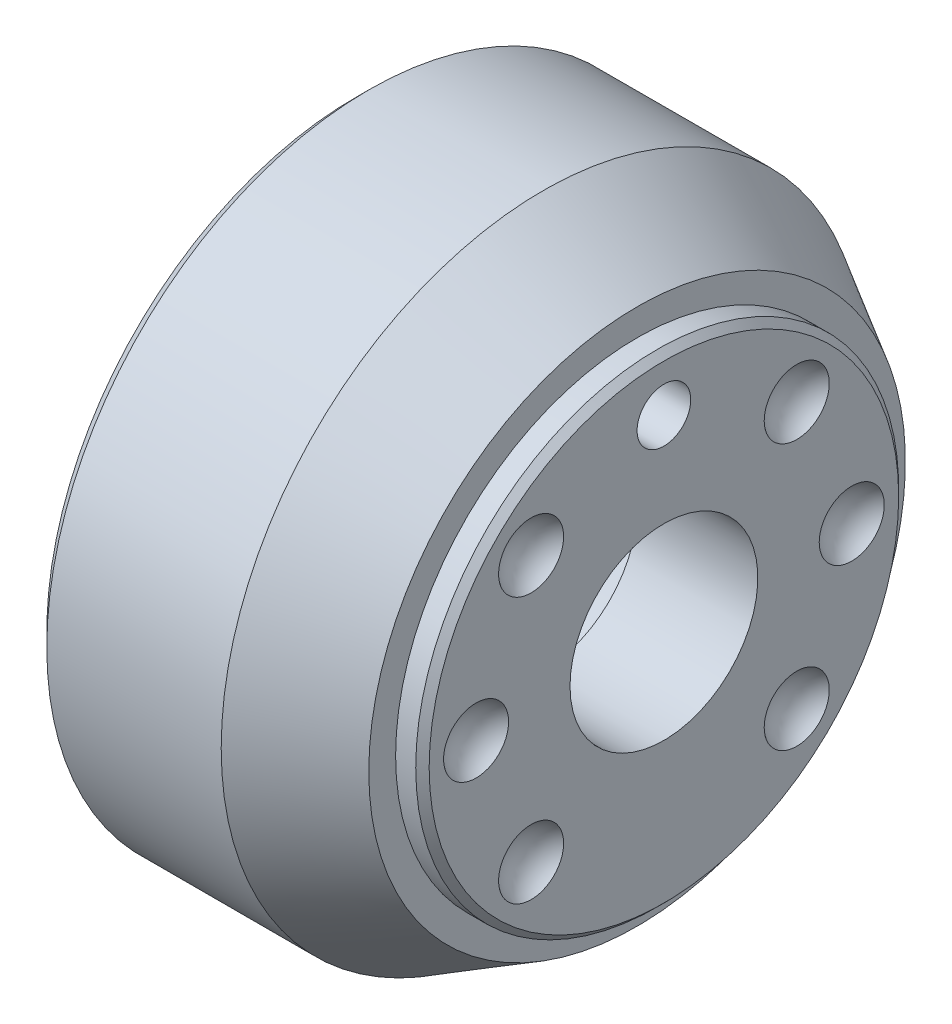
ISO-10303-21;
HEADER;
FILE_DESCRIPTION(('STEP AP214'),'2;1');
FILE_NAME('part.step','',(''),(''),'','','');
FILE_SCHEMA(('AUTOMOTIVE_DESIGN { 1 0 10303 214 1 1 1 1 }'));
ENDSEC;
DATA;
#1=APPLICATION_CONTEXT('core data for automotive mechanical design processes');
#2=APPLICATION_PROTOCOL_DEFINITION('international standard','automotive_design',2000,#1);
#3=PRODUCT_CONTEXT('',#1,'mechanical');
#4=PRODUCT('Part','Part','',(#3));
#5=PRODUCT_RELATED_PRODUCT_CATEGORY('part','',(#4));
#6=PRODUCT_DEFINITION_FORMATION('','',#4);
#7=PRODUCT_DEFINITION_CONTEXT('part definition',#1,'design');
#8=PRODUCT_DEFINITION('design','',#6,#7);
#9=PRODUCT_DEFINITION_SHAPE('','',#8);
#10=(LENGTH_UNIT() NAMED_UNIT(*) SI_UNIT(.MILLI.,.METRE.));
#11=(NAMED_UNIT(*) PLANE_ANGLE_UNIT() SI_UNIT($,.RADIAN.));
#12=(NAMED_UNIT(*) SI_UNIT($,.STERADIAN.) SOLID_ANGLE_UNIT());
#13=UNCERTAINTY_MEASURE_WITH_UNIT(LENGTH_MEASURE(1.E-05),#10,'distance_accuracy_value','');
#14=(GEOMETRIC_REPRESENTATION_CONTEXT(3) GLOBAL_UNCERTAINTY_ASSIGNED_CONTEXT((#13)) GLOBAL_UNIT_ASSIGNED_CONTEXT((#10,
#11,#12)) REPRESENTATION_CONTEXT('',''));
#15=CARTESIAN_POINT('',(0.,0.,0.));
#16=DIRECTION('',(0.,0.,1.));
#17=DIRECTION('',(1.,0.,0.));
#18=AXIS2_PLACEMENT_3D('',#15,#16,#17);
#19=CARTESIAN_POINT('',(-9.,7.,0.));
#20=DIRECTION('',(1.,0.,0.));
#21=DIRECTION('',(0.,0.,-1.));
#22=AXIS2_PLACEMENT_3D('',#19,#20,#21);
#23=PLANE('',#22);
#24=CARTESIAN_POINT('',(-9.,0.,0.));
#25=DIRECTION('',(-1.,0.,0.));
#26=DIRECTION('',(0.,0.,1.));
#27=AXIS2_PLACEMENT_3D('',#24,#25,#26);
#28=CIRCLE('',#27,7.);
#29=CARTESIAN_POINT('',(-9.,0.,7.));
#30=VERTEX_POINT('',#29);
#31=EDGE_CURVE('E111',#30,#30,#28,.T.);
#32=ORIENTED_EDGE('',*,*,#31,.F.);
#33=EDGE_LOOP('',(#32));
#34=FACE_BOUND('',#33,.T.);
#35=CARTESIAN_POINT('',(-9.,0.,0.));
#36=DIRECTION('',(-1.,0.,0.));
#37=DIRECTION('',(0.,0.,1.));
#38=AXIS2_PLACEMENT_3D('',#35,#36,#37);
#39=CIRCLE('',#38,9.);
#40=CARTESIAN_POINT('',(-9.,0.,9.));
#41=VERTEX_POINT('',#40);
#42=EDGE_CURVE('E139',#41,#41,#39,.T.);
#43=ORIENTED_EDGE('',*,*,#42,.T.);
#44=EDGE_LOOP('',(#43));
#45=FACE_BOUND('',#44,.T.);
#46=ADVANCED_FACE('F41',(#34,#45),#23,.F.);
#47=CARTESIAN_POINT('',(-36.9218818886025,0.,0.));
#48=DIRECTION('',(-1.,0.,0.));
#49=DIRECTION('',(0.,0.,1.));
#50=AXIS2_PLACEMENT_3D('',#47,#48,#49);
#51=CYLINDRICAL_SURFACE('',#50,9.);
#52=ORIENTED_EDGE('',*,*,#42,.F.);
#53=EDGE_LOOP('',(#52));
#54=FACE_BOUND('',#53,.T.);
#55=CARTESIAN_POINT('',(-8.,0.,0.));
#56=DIRECTION('',(-1.,0.,0.));
#57=DIRECTION('',(0.,0.,1.));
#58=AXIS2_PLACEMENT_3D('',#55,#56,#57);
#59=CIRCLE('',#58,9.);
#60=CARTESIAN_POINT('',(-8.,0.,9.));
#61=VERTEX_POINT('',#60);
#62=EDGE_CURVE('E136',#61,#61,#59,.T.);
#63=ORIENTED_EDGE('',*,*,#62,.T.);
#64=EDGE_LOOP('',(#63));
#65=FACE_BOUND('',#64,.T.);
#66=ADVANCED_FACE('F179',(#54,#65),#51,.T.);
#67=CARTESIAN_POINT('',(-8.,9.,0.));
#68=DIRECTION('',(1.,0.,0.));
#69=DIRECTION('',(0.,0.,-1.));
#70=AXIS2_PLACEMENT_3D('',#67,#68,#69);
#71=PLANE('',#70);
#72=ORIENTED_EDGE('',*,*,#62,.F.);
#73=EDGE_LOOP('',(#72));
#74=FACE_BOUND('',#73,.T.);
#75=CARTESIAN_POINT('',(-8.,0.,0.));
#76=DIRECTION('',(-1.,0.,0.));
#77=DIRECTION('',(0.,0.,1.));
#78=AXIS2_PLACEMENT_3D('',#75,#76,#77);
#79=CIRCLE('',#78,18.);
#80=CARTESIAN_POINT('',(-8.,0.,18.));
#81=VERTEX_POINT('',#80);
#82=EDGE_CURVE('E133',#81,#81,#79,.T.);
#83=ORIENTED_EDGE('',*,*,#82,.T.);
#84=EDGE_LOOP('',(#83));
#85=FACE_BOUND('',#84,.T.);
#86=ADVANCED_FACE('F185',(#74,#85),#71,.F.);
#87=CARTESIAN_POINT('',(-36.9218818886025,0.,0.));
#88=DIRECTION('',(-1.,0.,0.));
#89=DIRECTION('',(0.,0.,1.));
#90=AXIS2_PLACEMENT_3D('',#87,#88,#89);
#91=CYLINDRICAL_SURFACE('',#90,18.);
#92=ORIENTED_EDGE('',*,*,#82,.F.);
#93=EDGE_LOOP('',(#92));
#94=FACE_BOUND('',#93,.T.);
#95=CARTESIAN_POINT('',(-23.,0.,0.));
#96=DIRECTION('',(-1.,0.,0.));
#97=DIRECTION('',(0.,0.,1.));
#98=AXIS2_PLACEMENT_3D('',#95,#96,#97);
#99=CIRCLE('',#98,18.);
#100=CARTESIAN_POINT('',(-23.,0.,18.));
#101=VERTEX_POINT('',#100);
#102=EDGE_CURVE('E130',#101,#101,#99,.T.);
#103=ORIENTED_EDGE('',*,*,#102,.T.);
#104=EDGE_LOOP('',(#103));
#105=FACE_BOUND('',#104,.T.);
#106=ADVANCED_FACE('F198',(#94,#105),#91,.F.);
#107=CARTESIAN_POINT('',(-23.,18.,0.));
#108=DIRECTION('',(1.,0.,0.));
#109=DIRECTION('',(0.,0.,-1.));
#110=AXIS2_PLACEMENT_3D('',#107,#108,#109);
#111=PLANE('',#110);
#112=CARTESIAN_POINT('',(-23.,0.,0.));
#113=DIRECTION('',(1.,0.,0.));
#114=DIRECTION('',(0.,0.,-1.));
#115=AXIS2_PLACEMENT_3D('',#112,#113,#114);
#116=CIRCLE('',#115,23.);
#117=CARTESIAN_POINT('',(-23.,0.,-23.));
#118=VERTEX_POINT('',#117);
#119=EDGE_CURVE('E142',#118,#118,#116,.F.);
#120=ORIENTED_EDGE('',*,*,#119,.T.);
#121=EDGE_LOOP('',(#120));
#122=FACE_BOUND('',#121,.T.);
#123=CARTESIAN_POINT('',(-23.,20.75,0.));
#124=DIRECTION('',(-1.,0.,0.));
#125=DIRECTION('',(0.,0.,1.));
#126=AXIS2_PLACEMENT_3D('',#123,#124,#125);
#127=CIRCLE('',#126,2.025);
#128=CARTESIAN_POINT('',(-23.,20.75,2.025));
#129=VERTEX_POINT('',#128);
#130=EDGE_CURVE('E80',#129,#129,#127,.T.);
#131=ORIENTED_EDGE('',*,*,#130,.F.);
#132=EDGE_LOOP('',(#131));
#133=FACE_BOUND('',#132,.T.);
#134=CARTESIAN_POINT('',(-23.,0.,20.75));
#135=DIRECTION('',(-1.,0.,0.));
#136=DIRECTION('',(0.,0.,1.));
#137=AXIS2_PLACEMENT_3D('',#134,#135,#136);
#138=CIRCLE('',#137,2.025);
#139=CARTESIAN_POINT('',(-23.,0.,22.775));
#140=VERTEX_POINT('',#139);
#141=EDGE_CURVE('E73',#140,#140,#138,.T.);
#142=ORIENTED_EDGE('',*,*,#141,.F.);
#143=EDGE_LOOP('',(#142));
#144=FACE_BOUND('',#143,.T.);
#145=CARTESIAN_POINT('',(-23.,0.,-20.75));
#146=DIRECTION('',(-1.,0.,0.));
#147=DIRECTION('',(0.,0.,1.));
#148=AXIS2_PLACEMENT_3D('',#145,#146,#147);
#149=CIRCLE('',#148,2.025);
#150=CARTESIAN_POINT('',(-23.,0.,-18.725));
#151=VERTEX_POINT('',#150);
#152=EDGE_CURVE('E89',#151,#151,#149,.T.);
#153=ORIENTED_EDGE('',*,*,#152,.F.);
#154=EDGE_LOOP('',(#153));
#155=FACE_BOUND('',#154,.T.);
#156=CARTESIAN_POINT('',(-23.,-20.75,0.));
#157=DIRECTION('',(-1.,0.,0.));
#158=DIRECTION('',(0.,0.,1.));
#159=AXIS2_PLACEMENT_3D('',#156,#157,#158);
#160=CIRCLE('',#159,2.025);
#161=CARTESIAN_POINT('',(-23.,-20.75,2.025));
#162=VERTEX_POINT('',#161);
#163=EDGE_CURVE('E98',#162,#162,#160,.T.);
#164=ORIENTED_EDGE('',*,*,#163,.F.);
#165=EDGE_LOOP('',(#164));
#166=FACE_BOUND('',#165,.T.);
#167=ORIENTED_EDGE('',*,*,#102,.F.);
#168=EDGE_LOOP('',(#167));
#169=FACE_BOUND('',#168,.T.);
#170=ADVANCED_FACE('F202',(#122,#133,#144,#155,#166,#169),#111,.F.);
#171=CARTESIAN_POINT('',(-36.9218818886025,0.,0.));
#172=DIRECTION('',(-1.,0.,0.));
#173=DIRECTION('',(0.,0.,1.));
#174=AXIS2_PLACEMENT_3D('',#171,#172,#173);
#175=CYLINDRICAL_SURFACE('',#174,24.);
#176=CARTESIAN_POINT('',(-22.,0.,0.));
#177=DIRECTION('',(1.,0.,0.));
#178=DIRECTION('',(0.,0.,-1.));
#179=AXIS2_PLACEMENT_3D('',#176,#177,#178);
#180=CIRCLE('',#179,24.);
#181=CARTESIAN_POINT('',(-22.,0.,-24.));
#182=VERTEX_POINT('',#181);
#183=EDGE_CURVE('E161',#182,#182,#180,.T.);
#184=ORIENTED_EDGE('',*,*,#183,.T.);
#185=EDGE_LOOP('',(#184));
#186=FACE_BOUND('',#185,.T.);
#187=CARTESIAN_POINT('',(-9.,0.,0.));
#188=DIRECTION('',(-1.,0.,0.));
#189=DIRECTION('',(0.,0.,1.));
#190=AXIS2_PLACEMENT_3D('',#187,#188,#189);
#191=CIRCLE('',#190,24.);
#192=CARTESIAN_POINT('',(-9.,0.,24.));
#193=VERTEX_POINT('',#192);
#194=EDGE_CURVE('E127',#193,#193,#191,.T.);
#195=ORIENTED_EDGE('',*,*,#194,.T.);
#196=EDGE_LOOP('',(#195));
#197=FACE_BOUND('',#196,.T.);
#198=ADVANCED_FACE('F206',(#186,#197),#175,.T.);
#199=CARTESIAN_POINT('',(-2.,0.,0.));
#200=DIRECTION('',(-1.,0.,0.));
#201=DIRECTION('',(0.,0.,1.));
#202=AXIS2_PLACEMENT_3D('',#199,#200,#201);
#203=CONICAL_SURFACE('',#202,20.,0.519146114246523);
#204=ORIENTED_EDGE('',*,*,#194,.F.);
#205=EDGE_LOOP('',(#204));
#206=FACE_BOUND('',#205,.T.);
#207=CARTESIAN_POINT('',(-2.,0.,0.));
#208=DIRECTION('',(-1.,0.,0.));
#209=DIRECTION('',(0.,0.,1.));
#210=AXIS2_PLACEMENT_3D('',#207,#208,#209);
#211=CIRCLE('',#210,20.);
#212=CARTESIAN_POINT('',(-2.,0.,20.));
#213=VERTEX_POINT('',#212);
#214=EDGE_CURVE('E124',#213,#213,#211,.T.);
#215=ORIENTED_EDGE('',*,*,#214,.T.);
#216=EDGE_LOOP('',(#215));
#217=FACE_BOUND('',#216,.T.);
#218=ADVANCED_FACE('F210',(#206,#217),#203,.T.);
#219=CARTESIAN_POINT('',(-2.,20.,0.));
#220=DIRECTION('',(-1.,0.,0.));
#221=DIRECTION('',(0.,0.,1.));
#222=AXIS2_PLACEMENT_3D('',#219,#220,#221);
#223=PLANE('',#222);
#224=ORIENTED_EDGE('',*,*,#214,.F.);
#225=EDGE_LOOP('',(#224));
#226=FACE_BOUND('',#225,.T.);
#227=CARTESIAN_POINT('',(-2.,0.,0.));
#228=DIRECTION('',(-1.,0.,0.));
#229=DIRECTION('',(0.,0.,1.));
#230=AXIS2_PLACEMENT_3D('',#227,#228,#229);
#231=CIRCLE('',#230,18.);
#232=CARTESIAN_POINT('',(-2.,0.,18.));
#233=VERTEX_POINT('',#232);
#234=EDGE_CURVE('E121',#233,#233,#231,.T.);
#235=ORIENTED_EDGE('',*,*,#234,.T.);
#236=EDGE_LOOP('',(#235));
#237=FACE_BOUND('',#236,.T.);
#238=ADVANCED_FACE('F214',(#226,#237),#223,.F.);
#239=CARTESIAN_POINT('',(-36.9218818886025,0.,0.));
#240=DIRECTION('',(-1.,0.,0.));
#241=DIRECTION('',(0.,0.,1.));
#242=AXIS2_PLACEMENT_3D('',#239,#240,#241);
#243=CYLINDRICAL_SURFACE('',#242,18.);
#244=CARTESIAN_POINT('',(-0.499999999999994,0.,0.));
#245=DIRECTION('',(-1.,0.,0.));
#246=DIRECTION('',(0.,0.,1.));
#247=AXIS2_PLACEMENT_3D('',#244,#245,#246);
#248=CIRCLE('',#247,18.);
#249=CARTESIAN_POINT('',(-0.499999999999994,0.,18.));
#250=VERTEX_POINT('',#249);
#251=EDGE_CURVE('E50',#250,#250,#248,.T.);
#252=ORIENTED_EDGE('',*,*,#251,.T.);
#253=EDGE_LOOP('',(#252));
#254=FACE_BOUND('',#253,.T.);
#255=ORIENTED_EDGE('',*,*,#234,.F.);
#256=EDGE_LOOP('',(#255));
#257=FACE_BOUND('',#256,.T.);
#258=ADVANCED_FACE('F166',(#254,#257),#243,.T.);
#259=CARTESIAN_POINT('',(0.,18.,0.));
#260=DIRECTION('',(-1.,0.,0.));
#261=DIRECTION('',(0.,0.,1.));
#262=AXIS2_PLACEMENT_3D('',#259,#260,#261);
#263=PLANE('',#262);
#264=CARTESIAN_POINT('',(0.,0.,0.));
#265=DIRECTION('',(-1.,0.,0.));
#266=DIRECTION('',(0.,0.,1.));
#267=AXIS2_PLACEMENT_3D('',#264,#265,#266);
#268=CIRCLE('',#267,17.5);
#269=CARTESIAN_POINT('',(0.,0.,17.5));
#270=VERTEX_POINT('',#269);
#271=EDGE_CURVE('E11',#270,#270,#268,.F.);
#272=ORIENTED_EDGE('',*,*,#271,.T.);
#273=EDGE_LOOP('',(#272));
#274=FACE_BOUND('',#273,.T.);
#275=CARTESIAN_POINT('',(0.,9.89949493661154,-9.89949493661179));
#276=DIRECTION('',(-1.,0.,0.));
#277=DIRECTION('',(0.,0.,1.));
#278=AXIS2_PLACEMENT_3D('',#275,#276,#277);
#279=CIRCLE('',#278,2.42487113059643);
#280=CARTESIAN_POINT('',(0.,9.89949493661154,-7.47462380601536));
#281=VERTEX_POINT('',#280);
#282=EDGE_CURVE('E107',#281,#281,#279,.T.);
#283=ORIENTED_EDGE('',*,*,#282,.T.);
#284=EDGE_LOOP('',(#283));
#285=FACE_BOUND('',#284,.T.);
#286=CARTESIAN_POINT('',(0.,9.89949493661175,9.89949493661158));
#287=DIRECTION('',(-1.,0.,0.));
#288=DIRECTION('',(0.,0.,1.));
#289=AXIS2_PLACEMENT_3D('',#286,#287,#288);
#290=CIRCLE('',#289,2.42487113059643);
#291=CARTESIAN_POINT('',(0.,9.89949493661175,12.324366067208));
#292=VERTEX_POINT('',#291);
#293=EDGE_CURVE('E154',#292,#292,#290,.T.);
#294=ORIENTED_EDGE('',*,*,#293,.T.);
#295=EDGE_LOOP('',(#294));
#296=FACE_BOUND('',#295,.T.);
#297=CARTESIAN_POINT('',(0.,0.,14.));
#298=DIRECTION('',(-1.,0.,0.));
#299=DIRECTION('',(0.,0.,1.));
#300=AXIS2_PLACEMENT_3D('',#297,#298,#299);
#301=CIRCLE('',#300,2.42487113059643);
#302=CARTESIAN_POINT('',(0.,0.,16.4248711305964));
#303=VERTEX_POINT('',#302);
#304=EDGE_CURVE('E151',#303,#303,#301,.T.);
#305=ORIENTED_EDGE('',*,*,#304,.T.);
#306=EDGE_LOOP('',(#305));
#307=FACE_BOUND('',#306,.T.);
#308=CARTESIAN_POINT('',(0.,-9.89949493661161,9.89949493661172));
#309=DIRECTION('',(-1.,0.,0.));
#310=DIRECTION('',(0.,0.,1.));
#311=AXIS2_PLACEMENT_3D('',#308,#309,#310);
#312=CIRCLE('',#311,2.42487113059643);
#313=CARTESIAN_POINT('',(0.,-9.89949493661161,12.3243660672081));
#314=VERTEX_POINT('',#313);
#315=EDGE_CURVE('E148',#314,#314,#312,.T.);
#316=ORIENTED_EDGE('',*,*,#315,.T.);
#317=EDGE_LOOP('',(#316));
#318=FACE_BOUND('',#317,.T.);
#319=CARTESIAN_POINT('',(0.,-9.89949493661168,-9.89949493661165));
#320=DIRECTION('',(-1.,0.,0.));
#321=DIRECTION('',(0.,0.,1.));
#322=AXIS2_PLACEMENT_3D('',#319,#320,#321);
#323=CIRCLE('',#322,2.42487113059643);
#324=CARTESIAN_POINT('',(0.,-9.89949493661168,-7.47462380601522));
#325=VERTEX_POINT('',#324);
#326=EDGE_CURVE('E145',#325,#325,#323,.T.);
#327=ORIENTED_EDGE('',*,*,#326,.T.);
#328=EDGE_LOOP('',(#327));
#329=FACE_BOUND('',#328,.T.);
#330=CARTESIAN_POINT('',(0.,0.,-14.));
#331=DIRECTION('',(-1.,0.,0.));
#332=DIRECTION('',(0.,0.,1.));
#333=AXIS2_PLACEMENT_3D('',#330,#331,#332);
#334=CIRCLE('',#333,2.42487113059643);
#335=CARTESIAN_POINT('',(0.,0.,-11.5751288694036));
#336=VERTEX_POINT('',#335);
#337=EDGE_CURVE('E115',#336,#336,#334,.T.);
#338=ORIENTED_EDGE('',*,*,#337,.T.);
#339=EDGE_LOOP('',(#338));
#340=FACE_BOUND('',#339,.T.);
#341=CARTESIAN_POINT('',(0.,14.,0.));
#342=DIRECTION('',(1.,0.,0.));
#343=DIRECTION('',(0.,0.,-1.));
#344=AXIS2_PLACEMENT_3D('',#341,#342,#343);
#345=CIRCLE('',#344,2.);
#346=CARTESIAN_POINT('',(0.,14.,-2.));
#347=VERTEX_POINT('',#346);
#348=EDGE_CURVE('E112',#347,#347,#345,.T.);
#349=ORIENTED_EDGE('',*,*,#348,.F.);
#350=EDGE_LOOP('',(#349));
#351=FACE_BOUND('',#350,.T.);
#352=CARTESIAN_POINT('',(0.,0.,0.));
#353=DIRECTION('',(-1.,0.,0.));
#354=DIRECTION('',(0.,0.,1.));
#355=AXIS2_PLACEMENT_3D('',#352,#353,#354);
#356=CIRCLE('',#355,7.);
#357=CARTESIAN_POINT('',(0.,0.,7.));
#358=VERTEX_POINT('',#357);
#359=EDGE_CURVE('E118',#358,#358,#356,.T.);
#360=ORIENTED_EDGE('',*,*,#359,.T.);
#361=EDGE_LOOP('',(#360));
#362=FACE_BOUND('',#361,.T.);
#363=ADVANCED_FACE('F221',(#274,#285,#296,#307,#318,#329,#340,#351,#362),#263,.F.);
#364=CARTESIAN_POINT('',(-36.9218818886025,0.,0.));
#365=DIRECTION('',(-1.,0.,0.));
#366=DIRECTION('',(0.,0.,1.));
#367=AXIS2_PLACEMENT_3D('',#364,#365,#366);
#368=CYLINDRICAL_SURFACE('',#367,7.);
#369=ORIENTED_EDGE('',*,*,#359,.F.);
#370=EDGE_LOOP('',(#369));
#371=FACE_BOUND('',#370,.T.);
#372=ORIENTED_EDGE('',*,*,#31,.T.);
#373=EDGE_LOOP('',(#372));
#374=FACE_BOUND('',#373,.T.);
#375=ADVANCED_FACE('F224',(#371,#374),#368,.F.);
#376=CARTESIAN_POINT('',(-4.,14.,0.));
#377=DIRECTION('',(1.,0.,0.));
#378=DIRECTION('',(0.,0.,-1.));
#379=AXIS2_PLACEMENT_3D('',#376,#377,#378);
#380=CYLINDRICAL_SURFACE('',#379,2.);
#381=CARTESIAN_POINT('',(-4.,14.,0.));
#382=DIRECTION('',(1.,0.,0.));
#383=DIRECTION('',(0.,0.,-1.));
#384=AXIS2_PLACEMENT_3D('',#381,#382,#383);
#385=CIRCLE('',#384,2.);
#386=CARTESIAN_POINT('',(-4.,14.,-2.));
#387=VERTEX_POINT('',#386);
#388=EDGE_CURVE('E108',#387,#387,#385,.T.);
#389=ORIENTED_EDGE('',*,*,#388,.F.);
#390=EDGE_LOOP('',(#389));
#391=FACE_BOUND('',#390,.T.);
#392=ORIENTED_EDGE('',*,*,#348,.T.);
#393=EDGE_LOOP('',(#392));
#394=FACE_BOUND('',#393,.T.);
#395=ADVANCED_FACE('F228',(#391,#394),#380,.F.);
#396=CARTESIAN_POINT('',(-4.,14.,0.));
#397=DIRECTION('',(1.,0.,0.));
#398=DIRECTION('',(0.,0.,-1.));
#399=AXIS2_PLACEMENT_3D('',#396,#397,#398);
#400=PLANE('',#399);
#401=ORIENTED_EDGE('',*,*,#388,.T.);
#402=EDGE_LOOP('',(#401));
#403=FACE_BOUND('',#402,.T.);
#404=ADVANCED_FACE('F232',(#403),#400,.T.);
#405=CARTESIAN_POINT('',(1.4,0.,-14.));
#406=DIRECTION('',(0.,0.,-1.));
#407=DIRECTION('',(1.,0.,0.));
#408=AXIS2_PLACEMENT_3D('',#405,#406,#407);
#409=SPHERICAL_SURFACE('',#408,2.8);
#410=CARTESIAN_POINT('',(1.4,0.,-14.));
#411=DIRECTION('',(-1.,0.,0.));
#412=DIRECTION('',(0.,0.,1.));
#413=AXIS2_PLACEMENT_3D('',#410,#411,#412);
#414=SPHERICAL_SURFACE('',#413,2.8);
#415=ORIENTED_EDGE('',*,*,#337,.F.);
#416=EDGE_LOOP('',(#415));
#417=FACE_BOUND('',#416,.T.);
#418=ADVANCED_FACE('F236',(#417),#414,.F.);
#419=CARTESIAN_POINT('',(1.4,-9.89949493661168,-9.89949493661165));
#420=DIRECTION('',(0.,-0.707106781186549,-0.707106781186546));
#421=DIRECTION('',(1.,0.,0.));
#422=AXIS2_PLACEMENT_3D('',#419,#420,#421);
#423=SPHERICAL_SURFACE('',#422,2.8);
#424=CARTESIAN_POINT('',(1.4,-9.89949493661168,-9.89949493661165));
#425=DIRECTION('',(-1.,0.,0.));
#426=DIRECTION('',(0.,0.,1.));
#427=AXIS2_PLACEMENT_3D('',#424,#425,#426);
#428=SPHERICAL_SURFACE('',#427,2.8);
#429=ORIENTED_EDGE('',*,*,#326,.F.);
#430=EDGE_LOOP('',(#429));
#431=FACE_BOUND('',#430,.T.);
#432=ADVANCED_FACE('F240',(#431),#428,.F.);
#433=CARTESIAN_POINT('',(1.4,-9.89949493661161,9.89949493661172));
#434=DIRECTION('',(0.,-0.707106781186544,0.707106781186551));
#435=DIRECTION('',(1.,0.,0.));
#436=AXIS2_PLACEMENT_3D('',#433,#434,#435);
#437=SPHERICAL_SURFACE('',#436,2.8);
#438=CARTESIAN_POINT('',(1.4,-9.89949493661161,9.89949493661172));
#439=DIRECTION('',(-1.,0.,0.));
#440=DIRECTION('',(0.,0.,1.));
#441=AXIS2_PLACEMENT_3D('',#438,#439,#440);
#442=SPHERICAL_SURFACE('',#441,2.8);
#443=ORIENTED_EDGE('',*,*,#315,.F.);
#444=EDGE_LOOP('',(#443));
#445=FACE_BOUND('',#444,.T.);
#446=ADVANCED_FACE('F244',(#445),#442,.F.);
#447=CARTESIAN_POINT('',(1.4,0.,14.));
#448=DIRECTION('',(0.,0.,1.));
#449=DIRECTION('',(1.,0.,0.));
#450=AXIS2_PLACEMENT_3D('',#447,#448,#449);
#451=SPHERICAL_SURFACE('',#450,2.8);
#452=CARTESIAN_POINT('',(1.4,0.,14.));
#453=DIRECTION('',(-1.,0.,0.));
#454=DIRECTION('',(0.,0.,1.));
#455=AXIS2_PLACEMENT_3D('',#452,#453,#454);
#456=SPHERICAL_SURFACE('',#455,2.8);
#457=ORIENTED_EDGE('',*,*,#304,.F.);
#458=EDGE_LOOP('',(#457));
#459=FACE_BOUND('',#458,.T.);
#460=ADVANCED_FACE('F248',(#459),#456,.F.);
#461=CARTESIAN_POINT('',(1.4,9.89949493661175,9.89949493661158));
#462=DIRECTION('',(0.,0.707106781186554,0.707106781186541));
#463=DIRECTION('',(1.,0.,0.));
#464=AXIS2_PLACEMENT_3D('',#461,#462,#463);
#465=SPHERICAL_SURFACE('',#464,2.8);
#466=CARTESIAN_POINT('',(1.4,9.89949493661175,9.89949493661158));
#467=DIRECTION('',(-1.,0.,0.));
#468=DIRECTION('',(0.,0.,1.));
#469=AXIS2_PLACEMENT_3D('',#466,#467,#468);
#470=SPHERICAL_SURFACE('',#469,2.8);
#471=ORIENTED_EDGE('',*,*,#293,.F.);
#472=EDGE_LOOP('',(#471));
#473=FACE_BOUND('',#472,.T.);
#474=ADVANCED_FACE('F252',(#473),#470,.F.);
#475=CARTESIAN_POINT('',(1.4,9.89949493661154,-9.89949493661179));
#476=DIRECTION('',(0.,0.707106781186539,-0.707106781186556));
#477=DIRECTION('',(1.,0.,0.));
#478=AXIS2_PLACEMENT_3D('',#475,#476,#477);
#479=SPHERICAL_SURFACE('',#478,2.8);
#480=CARTESIAN_POINT('',(1.4,9.89949493661154,-9.89949493661179));
#481=DIRECTION('',(-1.,0.,0.));
#482=DIRECTION('',(0.,0.,1.));
#483=AXIS2_PLACEMENT_3D('',#480,#481,#482);
#484=SPHERICAL_SURFACE('',#483,2.8);
#485=ORIENTED_EDGE('',*,*,#282,.F.);
#486=EDGE_LOOP('',(#485));
#487=FACE_BOUND('',#486,.T.);
#488=ADVANCED_FACE('F256',(#487),#484,.F.);
#489=CARTESIAN_POINT('',(-15.,-20.75,0.));
#490=DIRECTION('',(-1.,0.,0.));
#491=DIRECTION('',(0.,0.,1.));
#492=AXIS2_PLACEMENT_3D('',#489,#490,#491);
#493=CONICAL_SURFACE('',#492,1.65,1.02974425867665);
#494=CARTESIAN_POINT('',(-14.0085799786045,-20.75,0.));
#495=VERTEX_POINT('',#494);
#496=VERTEX_LOOP('',#495);
#497=FACE_BOUND('',#496,.T.);
#498=CARTESIAN_POINT('',(-15.,-20.75,0.));
#499=DIRECTION('',(-1.,0.,0.));
#500=DIRECTION('',(0.,0.,1.));
#501=AXIS2_PLACEMENT_3D('',#498,#499,#500);
#502=CIRCLE('',#501,1.65);
#503=CARTESIAN_POINT('',(-15.,-20.75,1.65));
#504=VERTEX_POINT('',#503);
#505=EDGE_CURVE('E104',#504,#504,#502,.T.);
#506=ORIENTED_EDGE('',*,*,#505,.T.);
#507=EDGE_LOOP('',(#506));
#508=FACE_BOUND('',#507,.T.);
#509=ADVANCED_FACE('F260',(#497,#508),#493,.F.);
#510=CARTESIAN_POINT('',(-23.,-20.75,0.));
#511=DIRECTION('',(-1.,0.,0.));
#512=DIRECTION('',(0.,0.,1.));
#513=AXIS2_PLACEMENT_3D('',#510,#511,#512);
#514=CYLINDRICAL_SURFACE('',#513,1.65);
#515=ORIENTED_EDGE('',*,*,#505,.F.);
#516=EDGE_LOOP('',(#515));
#517=FACE_BOUND('',#516,.T.);
#518=CARTESIAN_POINT('',(-22.625,-20.75,0.));
#519=DIRECTION('',(-1.,0.,0.));
#520=DIRECTION('',(0.,0.,1.));
#521=AXIS2_PLACEMENT_3D('',#518,#519,#520);
#522=CIRCLE('',#521,1.65);
#523=CARTESIAN_POINT('',(-22.625,-20.75,1.65));
#524=VERTEX_POINT('',#523);
#525=EDGE_CURVE('E101',#524,#524,#522,.T.);
#526=ORIENTED_EDGE('',*,*,#525,.T.);
#527=EDGE_LOOP('',(#526));
#528=FACE_BOUND('',#527,.T.);
#529=ADVANCED_FACE('F264',(#517,#528),#514,.F.);
#530=CARTESIAN_POINT('',(-23.,-20.75,0.));
#531=DIRECTION('',(-1.,0.,0.));
#532=DIRECTION('',(0.,0.,1.));
#533=AXIS2_PLACEMENT_3D('',#530,#531,#532);
#534=CONICAL_SURFACE('',#533,2.025,0.785398163397448);
#535=ORIENTED_EDGE('',*,*,#525,.F.);
#536=EDGE_LOOP('',(#535));
#537=FACE_BOUND('',#536,.T.);
#538=ORIENTED_EDGE('',*,*,#163,.T.);
#539=EDGE_LOOP('',(#538));
#540=FACE_BOUND('',#539,.T.);
#541=ADVANCED_FACE('F267',(#537,#540),#534,.F.);
#542=CARTESIAN_POINT('',(-15.,0.,-20.75));
#543=DIRECTION('',(-1.,0.,0.));
#544=DIRECTION('',(0.,0.,1.));
#545=AXIS2_PLACEMENT_3D('',#542,#543,#544);
#546=CONICAL_SURFACE('',#545,1.65,1.02974425867665);
#547=CARTESIAN_POINT('',(-14.0085799786045,0.,-20.75));
#548=VERTEX_POINT('',#547);
#549=VERTEX_LOOP('',#548);
#550=FACE_BOUND('',#549,.T.);
#551=CARTESIAN_POINT('',(-15.,0.,-20.75));
#552=DIRECTION('',(-1.,0.,0.));
#553=DIRECTION('',(0.,0.,1.));
#554=AXIS2_PLACEMENT_3D('',#551,#552,#553);
#555=CIRCLE('',#554,1.65);
#556=CARTESIAN_POINT('',(-15.,0.,-19.1));
#557=VERTEX_POINT('',#556);
#558=EDGE_CURVE('E95',#557,#557,#555,.T.);
#559=ORIENTED_EDGE('',*,*,#558,.T.);
#560=EDGE_LOOP('',(#559));
#561=FACE_BOUND('',#560,.T.);
#562=ADVANCED_FACE('F271',(#550,#561),#546,.F.);
#563=CARTESIAN_POINT('',(-23.,0.,-20.75));
#564=DIRECTION('',(-1.,0.,0.));
#565=DIRECTION('',(0.,0.,1.));
#566=AXIS2_PLACEMENT_3D('',#563,#564,#565);
#567=CYLINDRICAL_SURFACE('',#566,1.65);
#568=ORIENTED_EDGE('',*,*,#558,.F.);
#569=EDGE_LOOP('',(#568));
#570=FACE_BOUND('',#569,.T.);
#571=CARTESIAN_POINT('',(-22.625,0.,-20.75));
#572=DIRECTION('',(-1.,0.,0.));
#573=DIRECTION('',(0.,0.,1.));
#574=AXIS2_PLACEMENT_3D('',#571,#572,#573);
#575=CIRCLE('',#574,1.65);
#576=CARTESIAN_POINT('',(-22.625,0.,-19.1));
#577=VERTEX_POINT('',#576);
#578=EDGE_CURVE('E92',#577,#577,#575,.T.);
#579=ORIENTED_EDGE('',*,*,#578,.T.);
#580=EDGE_LOOP('',(#579));
#581=FACE_BOUND('',#580,.T.);
#582=ADVANCED_FACE('F275',(#570,#581),#567,.F.);
#583=CARTESIAN_POINT('',(-23.,0.,-20.75));
#584=DIRECTION('',(-1.,0.,0.));
#585=DIRECTION('',(0.,0.,1.));
#586=AXIS2_PLACEMENT_3D('',#583,#584,#585);
#587=CONICAL_SURFACE('',#586,2.025,0.78539816339745);
#588=ORIENTED_EDGE('',*,*,#578,.F.);
#589=EDGE_LOOP('',(#588));
#590=FACE_BOUND('',#589,.T.);
#591=ORIENTED_EDGE('',*,*,#152,.T.);
#592=EDGE_LOOP('',(#591));
#593=FACE_BOUND('',#592,.T.);
#594=ADVANCED_FACE('F278',(#590,#593),#587,.F.);
#595=CARTESIAN_POINT('',(-15.,0.,20.75));
#596=DIRECTION('',(-1.,0.,0.));
#597=DIRECTION('',(0.,0.,1.));
#598=AXIS2_PLACEMENT_3D('',#595,#596,#597);
#599=CONICAL_SURFACE('',#598,1.65,1.02974425867665);
#600=CARTESIAN_POINT('',(-14.0085799786045,0.,20.75));
#601=VERTEX_POINT('',#600);
#602=VERTEX_LOOP('',#601);
#603=FACE_BOUND('',#602,.T.);
#604=CARTESIAN_POINT('',(-15.,0.,20.75));
#605=DIRECTION('',(-1.,0.,0.));
#606=DIRECTION('',(0.,0.,1.));
#607=AXIS2_PLACEMENT_3D('',#604,#605,#606);
#608=CIRCLE('',#607,1.65);
#609=CARTESIAN_POINT('',(-15.,0.,22.4));
#610=VERTEX_POINT('',#609);
#611=EDGE_CURVE('E86',#610,#610,#608,.T.);
#612=ORIENTED_EDGE('',*,*,#611,.T.);
#613=EDGE_LOOP('',(#612));
#614=FACE_BOUND('',#613,.T.);
#615=ADVANCED_FACE('F282',(#603,#614),#599,.F.);
#616=CARTESIAN_POINT('',(-23.,0.,20.75));
#617=DIRECTION('',(-1.,0.,0.));
#618=DIRECTION('',(0.,0.,1.));
#619=AXIS2_PLACEMENT_3D('',#616,#617,#618);
#620=CYLINDRICAL_SURFACE('',#619,1.65);
#621=ORIENTED_EDGE('',*,*,#611,.F.);
#622=EDGE_LOOP('',(#621));
#623=FACE_BOUND('',#622,.T.);
#624=CARTESIAN_POINT('',(-22.625,0.,20.75));
#625=DIRECTION('',(-1.,0.,0.));
#626=DIRECTION('',(0.,0.,1.));
#627=AXIS2_PLACEMENT_3D('',#624,#625,#626);
#628=CIRCLE('',#627,1.65);
#629=CARTESIAN_POINT('',(-22.625,0.,22.4));
#630=VERTEX_POINT('',#629);
#631=EDGE_CURVE('E77',#630,#630,#628,.T.);
#632=ORIENTED_EDGE('',*,*,#631,.T.);
#633=EDGE_LOOP('',(#632));
#634=FACE_BOUND('',#633,.T.);
#635=ADVANCED_FACE('F286',(#623,#634),#620,.F.);
#636=CARTESIAN_POINT('',(-23.,0.,20.75));
#637=DIRECTION('',(-1.,0.,0.));
#638=DIRECTION('',(0.,0.,1.));
#639=AXIS2_PLACEMENT_3D('',#636,#637,#638);
#640=CONICAL_SURFACE('',#639,2.025,0.78539816339745);
#641=ORIENTED_EDGE('',*,*,#631,.F.);
#642=EDGE_LOOP('',(#641));
#643=FACE_BOUND('',#642,.T.);
#644=ORIENTED_EDGE('',*,*,#141,.T.);
#645=EDGE_LOOP('',(#644));
#646=FACE_BOUND('',#645,.T.);
#647=ADVANCED_FACE('F67',(#643,#646),#640,.F.);
#648=CARTESIAN_POINT('',(-15.,20.75,0.));
#649=DIRECTION('',(-1.,0.,0.));
#650=DIRECTION('',(0.,0.,1.));
#651=AXIS2_PLACEMENT_3D('',#648,#649,#650);
#652=CONICAL_SURFACE('',#651,1.65,1.02974425867665);
#653=CARTESIAN_POINT('',(-14.0085799786045,20.75,0.));
#654=VERTEX_POINT('',#653);
#655=VERTEX_LOOP('',#654);
#656=FACE_BOUND('',#655,.T.);
#657=CARTESIAN_POINT('',(-15.,20.75,0.));
#658=DIRECTION('',(-1.,0.,0.));
#659=DIRECTION('',(0.,0.,1.));
#660=AXIS2_PLACEMENT_3D('',#657,#658,#659);
#661=CIRCLE('',#660,1.65);
#662=CARTESIAN_POINT('',(-15.,20.75,1.65));
#663=VERTEX_POINT('',#662);
#664=EDGE_CURVE('E71',#663,#663,#661,.T.);
#665=ORIENTED_EDGE('',*,*,#664,.T.);
#666=EDGE_LOOP('',(#665));
#667=FACE_BOUND('',#666,.T.);
#668=ADVANCED_FACE('F63',(#656,#667),#652,.F.);
#669=CARTESIAN_POINT('',(-23.,20.75,0.));
#670=DIRECTION('',(-1.,0.,0.));
#671=DIRECTION('',(0.,0.,1.));
#672=AXIS2_PLACEMENT_3D('',#669,#670,#671);
#673=CYLINDRICAL_SURFACE('',#672,1.65);
#674=ORIENTED_EDGE('',*,*,#664,.F.);
#675=EDGE_LOOP('',(#674));
#676=FACE_BOUND('',#675,.T.);
#677=CARTESIAN_POINT('',(-22.625,20.75,0.));
#678=DIRECTION('',(-1.,0.,0.));
#679=DIRECTION('',(0.,0.,1.));
#680=AXIS2_PLACEMENT_3D('',#677,#678,#679);
#681=CIRCLE('',#680,1.65);
#682=CARTESIAN_POINT('',(-22.625,20.75,1.65));
#683=VERTEX_POINT('',#682);
#684=EDGE_CURVE('E74',#683,#683,#681,.T.);
#685=ORIENTED_EDGE('',*,*,#684,.T.);
#686=EDGE_LOOP('',(#685));
#687=FACE_BOUND('',#686,.T.);
#688=ADVANCED_FACE('F66',(#676,#687),#673,.F.);
#689=CARTESIAN_POINT('',(-23.,20.75,0.));
#690=DIRECTION('',(-1.,0.,0.));
#691=DIRECTION('',(0.,0.,1.));
#692=AXIS2_PLACEMENT_3D('',#689,#690,#691);
#693=CONICAL_SURFACE('',#692,2.025,0.785398163397448);
#694=ORIENTED_EDGE('',*,*,#684,.F.);
#695=EDGE_LOOP('',(#694));
#696=FACE_BOUND('',#695,.T.);
#697=ORIENTED_EDGE('',*,*,#130,.T.);
#698=EDGE_LOOP('',(#697));
#699=FACE_BOUND('',#698,.T.);
#700=ADVANCED_FACE('F175',(#696,#699),#693,.F.);
#701=CARTESIAN_POINT('',(-23.,0.,0.));
#702=DIRECTION('',(1.,0.,0.));
#703=DIRECTION('',(0.,0.,-1.));
#704=AXIS2_PLACEMENT_3D('',#701,#702,#703);
#705=CONICAL_SURFACE('',#704,23.,0.785398163397448);
#706=ORIENTED_EDGE('',*,*,#183,.F.);
#707=EDGE_LOOP('',(#706));
#708=FACE_BOUND('',#707,.T.);
#709=ORIENTED_EDGE('',*,*,#119,.F.);
#710=EDGE_LOOP('',(#709));
#711=FACE_BOUND('',#710,.T.);
#712=ADVANCED_FACE('F170',(#708,#711),#705,.T.);
#713=CARTESIAN_POINT('',(-0.499999999999994,0.,0.));
#714=DIRECTION('',(-1.,0.,0.));
#715=DIRECTION('',(0.,0.,1.));
#716=AXIS2_PLACEMENT_3D('',#713,#714,#715);
#717=CONICAL_SURFACE('',#716,18.,0.785398163397452);
#718=ORIENTED_EDGE('',*,*,#271,.F.);
#719=EDGE_LOOP('',(#718));
#720=FACE_BOUND('',#719,.T.);
#721=ORIENTED_EDGE('',*,*,#251,.F.);
#722=EDGE_LOOP('',(#721));
#723=FACE_BOUND('',#722,.T.);
#724=ADVANCED_FACE('F44',(#720,#723),#717,.T.);
#725=CLOSED_SHELL('',(#46,#66,#86,#106,#170,#198,#218,#238,#258,#363,#375,#395,#404,#418,#432,
#446,#460,#474,#488,#509,#529,#541,#562,#582,#594,#615,#635,#647,#668,#688,#700,#712,#724));
#726=MANIFOLD_SOLID_BREP('B2',#725);
#727=ADVANCED_BREP_SHAPE_REPRESENTATION('',(#18,#726),#14);
#728=SHAPE_DEFINITION_REPRESENTATION(#9,#727);
ENDSEC;
END-ISO-10303-21;
